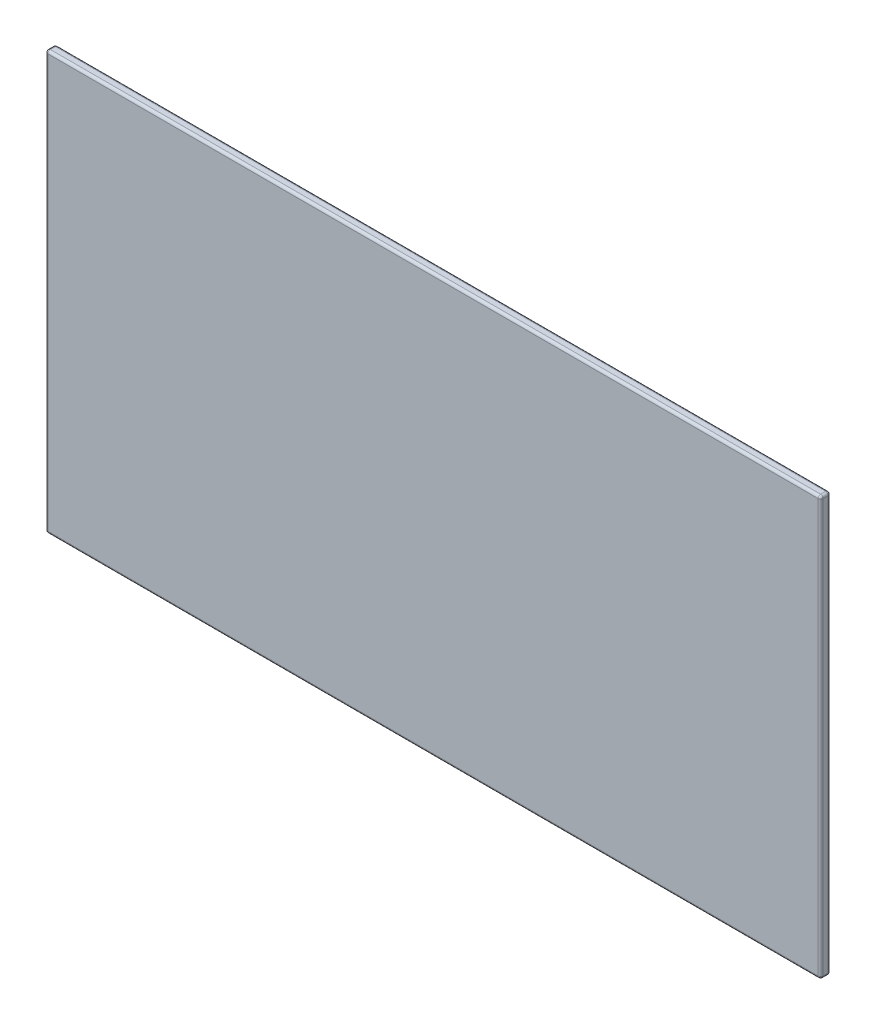
ISO-10303-21;
HEADER;
FILE_DESCRIPTION(('STEP AP214'),'2;1');
FILE_NAME('part.step','',(''),(''),'','','');
FILE_SCHEMA(('AUTOMOTIVE_DESIGN { 1 0 10303 214 1 1 1 1 }'));
ENDSEC;
DATA;
#1=APPLICATION_CONTEXT('core data for automotive mechanical design processes');
#2=APPLICATION_PROTOCOL_DEFINITION('international standard','automotive_design',2000,#1);
#3=PRODUCT_CONTEXT('',#1,'mechanical');
#4=PRODUCT('Part','Part','',(#3));
#5=PRODUCT_RELATED_PRODUCT_CATEGORY('part','',(#4));
#6=PRODUCT_DEFINITION_FORMATION('','',#4);
#7=PRODUCT_DEFINITION_CONTEXT('part definition',#1,'design');
#8=PRODUCT_DEFINITION('design','',#6,#7);
#9=PRODUCT_DEFINITION_SHAPE('','',#8);
#10=(LENGTH_UNIT() NAMED_UNIT(*) SI_UNIT(.MILLI.,.METRE.));
#11=(NAMED_UNIT(*) PLANE_ANGLE_UNIT() SI_UNIT($,.RADIAN.));
#12=(NAMED_UNIT(*) SI_UNIT($,.STERADIAN.) SOLID_ANGLE_UNIT());
#13=UNCERTAINTY_MEASURE_WITH_UNIT(LENGTH_MEASURE(1.E-05),#10,'distance_accuracy_value','');
#14=(GEOMETRIC_REPRESENTATION_CONTEXT(3) GLOBAL_UNCERTAINTY_ASSIGNED_CONTEXT((#13)) GLOBAL_UNIT_ASSIGNED_CONTEXT((#10,
#11,#12)) REPRESENTATION_CONTEXT('',''));
#15=CARTESIAN_POINT('',(0.,0.,0.));
#16=DIRECTION('',(0.,0.,1.));
#17=DIRECTION('',(1.,0.,0.));
#18=AXIS2_PLACEMENT_3D('',#15,#16,#17);
#19=CARTESIAN_POINT('',(77.35,-41.75,2.));
#20=DIRECTION('',(-1.,0.,0.));
#21=DIRECTION('',(0.,0.,1.));
#22=AXIS2_PLACEMENT_3D('',#19,#20,#21);
#23=PLANE('',#22);
#24=DIRECTION('',(0.,1.,0.));
#25=VECTOR('',#24,1.);
#26=CARTESIAN_POINT('',(77.35,-41.75,1.5));
#27=LINE('',#26,#25);
#28=CARTESIAN_POINT('',(77.35,41.25,1.5));
#29=VERTEX_POINT('',#28);
#30=CARTESIAN_POINT('',(77.35,-41.25,1.5));
#31=VERTEX_POINT('',#30);
#32=EDGE_CURVE('E42',#29,#31,#27,.F.);
#33=ORIENTED_EDGE('',*,*,#32,.T.);
#34=DIRECTION('',(0.,0.,-1.));
#35=VECTOR('',#34,1.);
#36=CARTESIAN_POINT('',(77.35,-41.25,2.));
#37=LINE('',#36,#35);
#38=CARTESIAN_POINT('',(77.35,-41.25,0.5));
#39=VERTEX_POINT('',#38);
#40=EDGE_CURVE('E11',#31,#39,#37,.T.);
#41=ORIENTED_EDGE('',*,*,#40,.T.);
#42=DIRECTION('',(0.,1.,0.));
#43=VECTOR('',#42,1.);
#44=CARTESIAN_POINT('',(77.35,41.75,0.5));
#45=LINE('',#44,#43);
#46=CARTESIAN_POINT('',(77.35,41.25,0.5));
#47=VERTEX_POINT('',#46);
#48=EDGE_CURVE('E194',#39,#47,#45,.T.);
#49=ORIENTED_EDGE('',*,*,#48,.T.);
#50=DIRECTION('',(0.,0.,-1.));
#51=VECTOR('',#50,1.);
#52=CARTESIAN_POINT('',(77.35,41.25,2.));
#53=LINE('',#52,#51);
#54=EDGE_CURVE('E53',#47,#29,#53,.F.);
#55=ORIENTED_EDGE('',*,*,#54,.T.);
#56=EDGE_LOOP('',(#33,#41,#49,#55));
#57=FACE_BOUND('',#56,.T.);
#58=ADVANCED_FACE('F33',(#57),#23,.F.);
#59=CARTESIAN_POINT('',(-77.35,41.75,2.));
#60=DIRECTION('',(0.,-1.,0.));
#61=DIRECTION('',(0.,0.,-1.));
#62=AXIS2_PLACEMENT_3D('',#59,#60,#61);
#63=PLANE('',#62);
#64=DIRECTION('',(0.,0.,-1.));
#65=VECTOR('',#64,1.);
#66=CARTESIAN_POINT('',(-76.85,41.75,2.));
#67=LINE('',#66,#65);
#68=CARTESIAN_POINT('',(-76.85,41.75,0.5));
#69=VERTEX_POINT('',#68);
#70=CARTESIAN_POINT('',(-76.85,41.75,1.5));
#71=VERTEX_POINT('',#70);
#72=EDGE_CURVE('E189',#69,#71,#67,.F.);
#73=ORIENTED_EDGE('',*,*,#72,.T.);
#74=DIRECTION('',(-1.,0.,0.));
#75=VECTOR('',#74,1.);
#76=CARTESIAN_POINT('',(-77.35,41.75,1.5));
#77=LINE('',#76,#75);
#78=CARTESIAN_POINT('',(76.85,41.75,1.5));
#79=VERTEX_POINT('',#78);
#80=EDGE_CURVE('E191',#71,#79,#77,.F.);
#81=ORIENTED_EDGE('',*,*,#80,.T.);
#82=DIRECTION('',(0.,0.,-1.));
#83=VECTOR('',#82,1.);
#84=CARTESIAN_POINT('',(76.85,41.75,2.));
#85=LINE('',#84,#83);
#86=CARTESIAN_POINT('',(76.85,41.75,0.5));
#87=VERTEX_POINT('',#86);
#88=EDGE_CURVE('E185',#79,#87,#85,.T.);
#89=ORIENTED_EDGE('',*,*,#88,.T.);
#90=DIRECTION('',(-1.,0.,0.));
#91=VECTOR('',#90,1.);
#92=CARTESIAN_POINT('',(-77.35,41.75,0.5));
#93=LINE('',#92,#91);
#94=EDGE_CURVE('E187',#87,#69,#93,.T.);
#95=ORIENTED_EDGE('',*,*,#94,.T.);
#96=EDGE_LOOP('',(#73,#81,#89,#95));
#97=FACE_BOUND('',#96,.T.);
#98=ADVANCED_FACE('F278',(#97),#63,.F.);
#99=CARTESIAN_POINT('',(-77.35,-41.75,2.));
#100=DIRECTION('',(1.,0.,0.));
#101=DIRECTION('',(0.,0.,-1.));
#102=AXIS2_PLACEMENT_3D('',#99,#100,#101);
#103=PLANE('',#102);
#104=DIRECTION('',(0.,0.,-1.));
#105=VECTOR('',#104,1.);
#106=CARTESIAN_POINT('',(-77.35,-41.25,2.));
#107=LINE('',#106,#105);
#108=CARTESIAN_POINT('',(-77.35,-41.25,0.5));
#109=VERTEX_POINT('',#108);
#110=CARTESIAN_POINT('',(-77.35,-41.25,1.5));
#111=VERTEX_POINT('',#110);
#112=EDGE_CURVE('E180',#109,#111,#107,.F.);
#113=ORIENTED_EDGE('',*,*,#112,.T.);
#114=DIRECTION('',(0.,-1.,0.));
#115=VECTOR('',#114,1.);
#116=CARTESIAN_POINT('',(-77.35,-41.75,1.5));
#117=LINE('',#116,#115);
#118=CARTESIAN_POINT('',(-77.35,41.25,1.5));
#119=VERTEX_POINT('',#118);
#120=EDGE_CURVE('E182',#111,#119,#117,.F.);
#121=ORIENTED_EDGE('',*,*,#120,.T.);
#122=DIRECTION('',(0.,0.,-1.));
#123=VECTOR('',#122,1.);
#124=CARTESIAN_POINT('',(-77.35,41.25,2.));
#125=LINE('',#124,#123);
#126=CARTESIAN_POINT('',(-77.35,41.25,0.5));
#127=VERTEX_POINT('',#126);
#128=EDGE_CURVE('E176',#119,#127,#125,.T.);
#129=ORIENTED_EDGE('',*,*,#128,.T.);
#130=DIRECTION('',(0.,-1.,0.));
#131=VECTOR('',#130,1.);
#132=CARTESIAN_POINT('',(-77.35,-41.75,0.5));
#133=LINE('',#132,#131);
#134=EDGE_CURVE('E178',#127,#109,#133,.T.);
#135=ORIENTED_EDGE('',*,*,#134,.T.);
#136=EDGE_LOOP('',(#113,#121,#129,#135));
#137=FACE_BOUND('',#136,.T.);
#138=ADVANCED_FACE('F269',(#137),#103,.F.);
#139=CARTESIAN_POINT('',(-77.35,-41.75,2.));
#140=DIRECTION('',(0.,1.,0.));
#141=DIRECTION('',(0.,0.,1.));
#142=AXIS2_PLACEMENT_3D('',#139,#140,#141);
#143=PLANE('',#142);
#144=DIRECTION('',(1.,0.,0.));
#145=VECTOR('',#144,1.);
#146=CARTESIAN_POINT('',(-77.35,-41.75,1.5));
#147=LINE('',#146,#145);
#148=CARTESIAN_POINT('',(76.85,-41.75,1.5));
#149=VERTEX_POINT('',#148);
#150=CARTESIAN_POINT('',(-76.85,-41.75,1.5));
#151=VERTEX_POINT('',#150);
#152=EDGE_CURVE('E129',#149,#151,#147,.F.);
#153=ORIENTED_EDGE('',*,*,#152,.T.);
#154=DIRECTION('',(0.,0.,-1.));
#155=VECTOR('',#154,1.);
#156=CARTESIAN_POINT('',(-76.85,-41.75,2.));
#157=LINE('',#156,#155);
#158=CARTESIAN_POINT('',(-76.85,-41.75,0.5));
#159=VERTEX_POINT('',#158);
#160=EDGE_CURVE('E165',#151,#159,#157,.T.);
#161=ORIENTED_EDGE('',*,*,#160,.T.);
#162=DIRECTION('',(1.,0.,0.));
#163=VECTOR('',#162,1.);
#164=CARTESIAN_POINT('',(77.35,-41.75,0.5));
#165=LINE('',#164,#163);
#166=CARTESIAN_POINT('',(76.85,-41.75,0.5));
#167=VERTEX_POINT('',#166);
#168=EDGE_CURVE('E158',#159,#167,#165,.T.);
#169=ORIENTED_EDGE('',*,*,#168,.T.);
#170=DIRECTION('',(0.,0.,-1.));
#171=VECTOR('',#170,1.);
#172=CARTESIAN_POINT('',(76.85,-41.75,2.));
#173=LINE('',#172,#171);
#174=EDGE_CURVE('E156',#167,#149,#173,.F.);
#175=ORIENTED_EDGE('',*,*,#174,.T.);
#176=EDGE_LOOP('',(#153,#161,#169,#175));
#177=FACE_BOUND('',#176,.T.);
#178=ADVANCED_FACE('F356',(#177),#143,.F.);
#179=CARTESIAN_POINT('',(0.,0.,2.));
#180=DIRECTION('',(0.,0.,-1.));
#181=DIRECTION('',(-1.,0.,0.));
#182=AXIS2_PLACEMENT_3D('',#179,#180,#181);
#183=PLANE('',#182);
#184=DIRECTION('',(0.,-1.,0.));
#185=VECTOR('',#184,1.);
#186=CARTESIAN_POINT('',(-76.85,0.,2.));
#187=LINE('',#186,#185);
#188=CARTESIAN_POINT('',(-76.85,41.25,2.));
#189=VERTEX_POINT('',#188);
#190=CARTESIAN_POINT('',(-76.85,-41.25,2.));
#191=VERTEX_POINT('',#190);
#192=EDGE_CURVE('E154',#189,#191,#187,.T.);
#193=ORIENTED_EDGE('',*,*,#192,.T.);
#194=DIRECTION('',(1.,0.,0.));
#195=VECTOR('',#194,1.);
#196=CARTESIAN_POINT('',(0.,-41.25,2.));
#197=LINE('',#196,#195);
#198=CARTESIAN_POINT('',(76.85,-41.25,2.));
#199=VERTEX_POINT('',#198);
#200=EDGE_CURVE('E127',#191,#199,#197,.T.);
#201=ORIENTED_EDGE('',*,*,#200,.T.);
#202=DIRECTION('',(0.,1.,0.));
#203=VECTOR('',#202,1.);
#204=CARTESIAN_POINT('',(76.85,0.,2.));
#205=LINE('',#204,#203);
#206=CARTESIAN_POINT('',(76.85,41.25,2.));
#207=VERTEX_POINT('',#206);
#208=EDGE_CURVE('E144',#199,#207,#205,.T.);
#209=ORIENTED_EDGE('',*,*,#208,.T.);
#210=DIRECTION('',(-1.,0.,0.));
#211=VECTOR('',#210,1.);
#212=CARTESIAN_POINT('',(0.,41.25,2.));
#213=LINE('',#212,#211);
#214=EDGE_CURVE('E150',#207,#189,#213,.T.);
#215=ORIENTED_EDGE('',*,*,#214,.T.);
#216=EDGE_LOOP('',(#193,#201,#209,#215));
#217=FACE_BOUND('',#216,.T.);
#218=ADVANCED_FACE('F152',(#217),#183,.F.);
#219=CARTESIAN_POINT('',(0.,0.,0.));
#220=DIRECTION('',(0.,0.,-1.));
#221=DIRECTION('',(-1.,0.,0.));
#222=AXIS2_PLACEMENT_3D('',#219,#220,#221);
#223=PLANE('',#222);
#224=DIRECTION('',(0.,1.,0.));
#225=VECTOR('',#224,1.);
#226=CARTESIAN_POINT('',(76.85,-41.75,0.));
#227=LINE('',#226,#225);
#228=CARTESIAN_POINT('',(76.85,41.25,0.));
#229=VERTEX_POINT('',#228);
#230=CARTESIAN_POINT('',(76.85,-41.25,0.));
#231=VERTEX_POINT('',#230);
#232=EDGE_CURVE('E167',#229,#231,#227,.F.);
#233=ORIENTED_EDGE('',*,*,#232,.T.);
#234=DIRECTION('',(1.,0.,0.));
#235=VECTOR('',#234,1.);
#236=CARTESIAN_POINT('',(-77.35,-41.25,0.));
#237=LINE('',#236,#235);
#238=CARTESIAN_POINT('',(-76.85,-41.25,0.));
#239=VERTEX_POINT('',#238);
#240=EDGE_CURVE('E173',#231,#239,#237,.F.);
#241=ORIENTED_EDGE('',*,*,#240,.T.);
#242=DIRECTION('',(0.,-1.,0.));
#243=VECTOR('',#242,1.);
#244=CARTESIAN_POINT('',(-76.85,41.75,0.));
#245=LINE('',#244,#243);
#246=CARTESIAN_POINT('',(-76.85,41.25,0.));
#247=VERTEX_POINT('',#246);
#248=EDGE_CURVE('E171',#239,#247,#245,.F.);
#249=ORIENTED_EDGE('',*,*,#248,.T.);
#250=DIRECTION('',(-1.,0.,0.));
#251=VECTOR('',#250,1.);
#252=CARTESIAN_POINT('',(77.35,41.25,0.));
#253=LINE('',#252,#251);
#254=EDGE_CURVE('E169',#247,#229,#253,.F.);
#255=ORIENTED_EDGE('',*,*,#254,.T.);
#256=EDGE_LOOP('',(#233,#241,#249,#255));
#257=FACE_BOUND('',#256,.T.);
#258=ADVANCED_FACE('F296',(#257),#223,.T.);
#259=CARTESIAN_POINT('',(-77.35,41.25,0.5));
#260=DIRECTION('',(1.,0.,0.));
#261=DIRECTION('',(0.,0.,-1.));
#262=AXIS2_PLACEMENT_3D('',#259,#260,#261);
#263=CYLINDRICAL_SURFACE('',#262,0.5);
#264=CARTESIAN_POINT('',(-76.85,41.25,0.5));
#265=DIRECTION('',(-1.,0.,0.));
#266=DIRECTION('',(0.,0.,1.));
#267=AXIS2_PLACEMENT_3D('',#264,#265,#266);
#268=CIRCLE('',#267,0.5);
#269=EDGE_CURVE('E37',#69,#247,#268,.T.);
#270=ORIENTED_EDGE('',*,*,#269,.F.);
#271=ORIENTED_EDGE('',*,*,#94,.F.);
#272=CARTESIAN_POINT('',(76.85,41.25,0.5));
#273=DIRECTION('',(1.,0.,0.));
#274=DIRECTION('',(0.,0.,-1.));
#275=AXIS2_PLACEMENT_3D('',#272,#273,#274);
#276=CIRCLE('',#275,0.5);
#277=EDGE_CURVE('E246',#229,#87,#276,.T.);
#278=ORIENTED_EDGE('',*,*,#277,.F.);
#279=ORIENTED_EDGE('',*,*,#254,.F.);
#280=EDGE_LOOP('',(#270,#271,#278,#279));
#281=FACE_BOUND('',#280,.T.);
#282=ADVANCED_FACE('F35',(#281),#263,.T.);
#283=CARTESIAN_POINT('',(-76.85,41.25,0.5));
#284=DIRECTION('',(0.,0.,1.));
#285=DIRECTION('',(1.,0.,0.));
#286=AXIS2_PLACEMENT_3D('',#283,#284,#285);
#287=SPHERICAL_SURFACE('',#286,0.5);
#288=CARTESIAN_POINT('',(-76.85,41.25,0.5));
#289=DIRECTION('',(0.,0.,-1.));
#290=DIRECTION('',(-1.,0.,0.));
#291=AXIS2_PLACEMENT_3D('',#288,#289,#290);
#292=CIRCLE('',#291,0.5);
#293=EDGE_CURVE('E241',#69,#127,#292,.F.);
#294=ORIENTED_EDGE('',*,*,#293,.F.);
#295=ORIENTED_EDGE('',*,*,#269,.T.);
#296=CARTESIAN_POINT('',(-76.85,41.25,0.5));
#297=DIRECTION('',(0.,1.,0.));
#298=DIRECTION('',(0.,0.,1.));
#299=AXIS2_PLACEMENT_3D('',#296,#297,#298);
#300=CIRCLE('',#299,0.5);
#301=EDGE_CURVE('E244',#127,#247,#300,.F.);
#302=ORIENTED_EDGE('',*,*,#301,.F.);
#303=EDGE_LOOP('',(#294,#295,#302));
#304=FACE_BOUND('',#303,.T.);
#305=ADVANCED_FACE('F257',(#304),#287,.T.);
#306=CARTESIAN_POINT('',(76.85,41.25,0.5));
#307=DIRECTION('',(0.,0.,1.));
#308=DIRECTION('',(1.,0.,0.));
#309=AXIS2_PLACEMENT_3D('',#306,#307,#308);
#310=SPHERICAL_SURFACE('',#309,0.5);
#311=CARTESIAN_POINT('',(76.85,41.25,0.5));
#312=DIRECTION('',(0.,1.,0.));
#313=DIRECTION('',(0.,0.,1.));
#314=AXIS2_PLACEMENT_3D('',#311,#312,#313);
#315=CIRCLE('',#314,0.5);
#316=EDGE_CURVE('E235',#229,#47,#315,.F.);
#317=ORIENTED_EDGE('',*,*,#316,.F.);
#318=ORIENTED_EDGE('',*,*,#277,.T.);
#319=CARTESIAN_POINT('',(76.85,41.25,0.5));
#320=DIRECTION('',(0.,0.,-1.));
#321=DIRECTION('',(-1.,0.,0.));
#322=AXIS2_PLACEMENT_3D('',#319,#320,#321);
#323=CIRCLE('',#322,0.5);
#324=EDGE_CURVE('E238',#47,#87,#323,.F.);
#325=ORIENTED_EDGE('',*,*,#324,.F.);
#326=EDGE_LOOP('',(#317,#318,#325));
#327=FACE_BOUND('',#326,.T.);
#328=ADVANCED_FACE('F289',(#327),#310,.T.);
#329=CARTESIAN_POINT('',(-76.85,-41.75,0.5));
#330=DIRECTION('',(0.,1.,0.));
#331=DIRECTION('',(0.,0.,1.));
#332=AXIS2_PLACEMENT_3D('',#329,#330,#331);
#333=CYLINDRICAL_SURFACE('',#332,0.5);
#334=ORIENTED_EDGE('',*,*,#301,.T.);
#335=ORIENTED_EDGE('',*,*,#248,.F.);
#336=CARTESIAN_POINT('',(-76.85,-41.25,0.5));
#337=DIRECTION('',(0.,-1.,0.));
#338=DIRECTION('',(0.,0.,-1.));
#339=AXIS2_PLACEMENT_3D('',#336,#337,#338);
#340=CIRCLE('',#339,0.5);
#341=EDGE_CURVE('E230',#109,#239,#340,.T.);
#342=ORIENTED_EDGE('',*,*,#341,.F.);
#343=ORIENTED_EDGE('',*,*,#134,.F.);
#344=EDGE_LOOP('',(#334,#335,#342,#343));
#345=FACE_BOUND('',#344,.T.);
#346=ADVANCED_FACE('F265',(#345),#333,.T.);
#347=CARTESIAN_POINT('',(-76.85,41.25,2.));
#348=DIRECTION('',(0.,0.,-1.));
#349=DIRECTION('',(-1.,0.,0.));
#350=AXIS2_PLACEMENT_3D('',#347,#348,#349);
#351=CYLINDRICAL_SURFACE('',#350,0.5);
#352=ORIENTED_EDGE('',*,*,#293,.T.);
#353=ORIENTED_EDGE('',*,*,#128,.F.);
#354=CARTESIAN_POINT('',(-76.85,41.25,1.5));
#355=DIRECTION('',(0.,0.,1.));
#356=DIRECTION('',(1.,0.,0.));
#357=AXIS2_PLACEMENT_3D('',#354,#355,#356);
#358=CIRCLE('',#357,0.5);
#359=EDGE_CURVE('E227',#71,#119,#358,.T.);
#360=ORIENTED_EDGE('',*,*,#359,.F.);
#361=ORIENTED_EDGE('',*,*,#72,.F.);
#362=EDGE_LOOP('',(#352,#353,#360,#361));
#363=FACE_BOUND('',#362,.T.);
#364=ADVANCED_FACE('F275',(#363),#351,.T.);
#365=CARTESIAN_POINT('',(0.,41.25,1.5));
#366=DIRECTION('',(-1.,0.,0.));
#367=DIRECTION('',(0.,0.,1.));
#368=AXIS2_PLACEMENT_3D('',#365,#366,#367);
#369=CYLINDRICAL_SURFACE('',#368,0.5);
#370=CARTESIAN_POINT('',(76.85,41.25,1.5));
#371=DIRECTION('',(1.,0.,0.));
#372=DIRECTION('',(0.,0.,-1.));
#373=AXIS2_PLACEMENT_3D('',#370,#371,#372);
#374=CIRCLE('',#373,0.5);
#375=EDGE_CURVE('E221',#79,#207,#374,.T.);
#376=ORIENTED_EDGE('',*,*,#375,.F.);
#377=ORIENTED_EDGE('',*,*,#80,.F.);
#378=CARTESIAN_POINT('',(-76.85,41.25,1.5));
#379=DIRECTION('',(-1.,0.,0.));
#380=DIRECTION('',(0.,0.,1.));
#381=AXIS2_PLACEMENT_3D('',#378,#379,#380);
#382=CIRCLE('',#381,0.5);
#383=EDGE_CURVE('E224',#189,#71,#382,.T.);
#384=ORIENTED_EDGE('',*,*,#383,.F.);
#385=ORIENTED_EDGE('',*,*,#214,.F.);
#386=EDGE_LOOP('',(#376,#377,#384,#385));
#387=FACE_BOUND('',#386,.T.);
#388=ADVANCED_FACE('F282',(#387),#369,.T.);
#389=CARTESIAN_POINT('',(76.85,41.25,2.));
#390=DIRECTION('',(0.,0.,-1.));
#391=DIRECTION('',(-1.,0.,0.));
#392=AXIS2_PLACEMENT_3D('',#389,#390,#391);
#393=CYLINDRICAL_SURFACE('',#392,0.5);
#394=ORIENTED_EDGE('',*,*,#324,.T.);
#395=ORIENTED_EDGE('',*,*,#88,.F.);
#396=CARTESIAN_POINT('',(76.85,41.25,1.5));
#397=DIRECTION('',(0.,0.,1.));
#398=DIRECTION('',(1.,0.,0.));
#399=AXIS2_PLACEMENT_3D('',#396,#397,#398);
#400=CIRCLE('',#399,0.5);
#401=EDGE_CURVE('E219',#29,#79,#400,.T.);
#402=ORIENTED_EDGE('',*,*,#401,.F.);
#403=ORIENTED_EDGE('',*,*,#54,.F.);
#404=EDGE_LOOP('',(#394,#395,#402,#403));
#405=FACE_BOUND('',#404,.T.);
#406=ADVANCED_FACE('F287',(#405),#393,.T.);
#407=CARTESIAN_POINT('',(76.85,-41.75,0.5));
#408=DIRECTION('',(0.,-1.,0.));
#409=DIRECTION('',(0.,0.,-1.));
#410=AXIS2_PLACEMENT_3D('',#407,#408,#409);
#411=CYLINDRICAL_SURFACE('',#410,0.5);
#412=ORIENTED_EDGE('',*,*,#316,.T.);
#413=ORIENTED_EDGE('',*,*,#48,.F.);
#414=CARTESIAN_POINT('',(76.85,-41.25,0.5));
#415=DIRECTION('',(0.,-1.,0.));
#416=DIRECTION('',(0.,0.,-1.));
#417=AXIS2_PLACEMENT_3D('',#414,#415,#416);
#418=CIRCLE('',#417,0.5);
#419=EDGE_CURVE('E216',#231,#39,#418,.T.);
#420=ORIENTED_EDGE('',*,*,#419,.F.);
#421=ORIENTED_EDGE('',*,*,#232,.F.);
#422=EDGE_LOOP('',(#412,#413,#420,#421));
#423=FACE_BOUND('',#422,.T.);
#424=ADVANCED_FACE('F293',(#423),#411,.T.);
#425=CARTESIAN_POINT('',(-77.35,-41.25,0.5));
#426=DIRECTION('',(-1.,0.,0.));
#427=DIRECTION('',(0.,0.,1.));
#428=AXIS2_PLACEMENT_3D('',#425,#426,#427);
#429=CYLINDRICAL_SURFACE('',#428,0.5);
#430=CARTESIAN_POINT('',(-76.85,-41.25,0.5));
#431=DIRECTION('',(-1.,0.,0.));
#432=DIRECTION('',(0.,0.,1.));
#433=AXIS2_PLACEMENT_3D('',#430,#431,#432);
#434=CIRCLE('',#433,0.5);
#435=EDGE_CURVE('E232',#239,#159,#434,.T.);
#436=ORIENTED_EDGE('',*,*,#435,.F.);
#437=ORIENTED_EDGE('',*,*,#240,.F.);
#438=CARTESIAN_POINT('',(76.85,-41.25,0.5));
#439=DIRECTION('',(1.,0.,0.));
#440=DIRECTION('',(0.,0.,-1.));
#441=AXIS2_PLACEMENT_3D('',#438,#439,#440);
#442=CIRCLE('',#441,0.5);
#443=EDGE_CURVE('E213',#167,#231,#442,.T.);
#444=ORIENTED_EDGE('',*,*,#443,.F.);
#445=ORIENTED_EDGE('',*,*,#168,.F.);
#446=EDGE_LOOP('',(#436,#437,#444,#445));
#447=FACE_BOUND('',#446,.T.);
#448=ADVANCED_FACE('F300',(#447),#429,.T.);
#449=CARTESIAN_POINT('',(-76.85,-41.25,0.5));
#450=DIRECTION('',(0.,0.,1.));
#451=DIRECTION('',(1.,0.,0.));
#452=AXIS2_PLACEMENT_3D('',#449,#450,#451);
#453=SPHERICAL_SURFACE('',#452,0.5);
#454=ORIENTED_EDGE('',*,*,#341,.T.);
#455=ORIENTED_EDGE('',*,*,#435,.T.);
#456=CARTESIAN_POINT('',(-76.85,-41.25,0.5));
#457=DIRECTION('',(0.,0.,-1.));
#458=DIRECTION('',(-1.,0.,0.));
#459=AXIS2_PLACEMENT_3D('',#456,#457,#458);
#460=CIRCLE('',#459,0.5);
#461=EDGE_CURVE('E210',#109,#159,#460,.F.);
#462=ORIENTED_EDGE('',*,*,#461,.F.);
#463=EDGE_LOOP('',(#454,#455,#462));
#464=FACE_BOUND('',#463,.T.);
#465=ADVANCED_FACE('F304',(#464),#453,.T.);
#466=CARTESIAN_POINT('',(-76.85,41.25,1.5));
#467=DIRECTION('',(0.,0.,1.));
#468=DIRECTION('',(1.,0.,0.));
#469=AXIS2_PLACEMENT_3D('',#466,#467,#468);
#470=SPHERICAL_SURFACE('',#469,0.5);
#471=ORIENTED_EDGE('',*,*,#383,.T.);
#472=ORIENTED_EDGE('',*,*,#359,.T.);
#473=CARTESIAN_POINT('',(-76.85,41.25,1.5));
#474=DIRECTION('',(0.,1.,0.));
#475=DIRECTION('',(0.,0.,1.));
#476=AXIS2_PLACEMENT_3D('',#473,#474,#475);
#477=CIRCLE('',#476,0.5);
#478=EDGE_CURVE('E208',#189,#119,#477,.F.);
#479=ORIENTED_EDGE('',*,*,#478,.F.);
#480=EDGE_LOOP('',(#471,#472,#479));
#481=FACE_BOUND('',#480,.T.);
#482=ADVANCED_FACE('F315',(#481),#470,.T.);
#483=CARTESIAN_POINT('',(76.85,41.25,1.5));
#484=DIRECTION('',(0.,0.,1.));
#485=DIRECTION('',(1.,0.,0.));
#486=AXIS2_PLACEMENT_3D('',#483,#484,#485);
#487=SPHERICAL_SURFACE('',#486,0.5);
#488=ORIENTED_EDGE('',*,*,#401,.T.);
#489=ORIENTED_EDGE('',*,*,#375,.T.);
#490=CARTESIAN_POINT('',(76.85,41.25,1.5));
#491=DIRECTION('',(0.,1.,0.));
#492=DIRECTION('',(0.,0.,1.));
#493=AXIS2_PLACEMENT_3D('',#490,#491,#492);
#494=CIRCLE('',#493,0.5);
#495=EDGE_CURVE('E147',#29,#207,#494,.F.);
#496=ORIENTED_EDGE('',*,*,#495,.F.);
#497=EDGE_LOOP('',(#488,#489,#496));
#498=FACE_BOUND('',#497,.T.);
#499=ADVANCED_FACE('F317',(#498),#487,.T.);
#500=CARTESIAN_POINT('',(76.85,-41.25,0.5));
#501=DIRECTION('',(0.,0.,1.));
#502=DIRECTION('',(1.,0.,0.));
#503=AXIS2_PLACEMENT_3D('',#500,#501,#502);
#504=SPHERICAL_SURFACE('',#503,0.5);
#505=ORIENTED_EDGE('',*,*,#443,.T.);
#506=ORIENTED_EDGE('',*,*,#419,.T.);
#507=CARTESIAN_POINT('',(76.85,-41.25,0.5));
#508=DIRECTION('',(0.,0.,-1.));
#509=DIRECTION('',(-1.,0.,0.));
#510=AXIS2_PLACEMENT_3D('',#507,#508,#509);
#511=CIRCLE('',#510,0.5);
#512=EDGE_CURVE('E205',#167,#39,#511,.F.);
#513=ORIENTED_EDGE('',*,*,#512,.F.);
#514=EDGE_LOOP('',(#505,#506,#513));
#515=FACE_BOUND('',#514,.T.);
#516=ADVANCED_FACE('F323',(#515),#504,.T.);
#517=CARTESIAN_POINT('',(-76.85,-41.25,2.));
#518=DIRECTION('',(0.,0.,-1.));
#519=DIRECTION('',(-1.,0.,0.));
#520=AXIS2_PLACEMENT_3D('',#517,#518,#519);
#521=CYLINDRICAL_SURFACE('',#520,0.5);
#522=ORIENTED_EDGE('',*,*,#461,.T.);
#523=ORIENTED_EDGE('',*,*,#160,.F.);
#524=CARTESIAN_POINT('',(-76.85,-41.25,1.5));
#525=DIRECTION('',(0.,0.,1.));
#526=DIRECTION('',(1.,0.,0.));
#527=AXIS2_PLACEMENT_3D('',#524,#525,#526);
#528=CIRCLE('',#527,0.5);
#529=EDGE_CURVE('E202',#111,#151,#528,.T.);
#530=ORIENTED_EDGE('',*,*,#529,.F.);
#531=ORIENTED_EDGE('',*,*,#112,.F.);
#532=EDGE_LOOP('',(#522,#523,#530,#531));
#533=FACE_BOUND('',#532,.T.);
#534=ADVANCED_FACE('F307',(#533),#521,.T.);
#535=CARTESIAN_POINT('',(-76.85,0.,1.5));
#536=DIRECTION('',(0.,-1.,0.));
#537=DIRECTION('',(0.,0.,-1.));
#538=AXIS2_PLACEMENT_3D('',#535,#536,#537);
#539=CYLINDRICAL_SURFACE('',#538,0.5);
#540=ORIENTED_EDGE('',*,*,#478,.T.);
#541=ORIENTED_EDGE('',*,*,#120,.F.);
#542=CARTESIAN_POINT('',(-76.85,-41.25,1.5));
#543=DIRECTION('',(0.,-1.,0.));
#544=DIRECTION('',(0.,0.,-1.));
#545=AXIS2_PLACEMENT_3D('',#542,#543,#544);
#546=CIRCLE('',#545,0.5);
#547=EDGE_CURVE('E141',#191,#111,#546,.T.);
#548=ORIENTED_EDGE('',*,*,#547,.F.);
#549=ORIENTED_EDGE('',*,*,#192,.F.);
#550=EDGE_LOOP('',(#540,#541,#548,#549));
#551=FACE_BOUND('',#550,.T.);
#552=ADVANCED_FACE('F313',(#551),#539,.T.);
#553=CARTESIAN_POINT('',(76.85,0.,1.5));
#554=DIRECTION('',(0.,1.,0.));
#555=DIRECTION('',(0.,0.,1.));
#556=AXIS2_PLACEMENT_3D('',#553,#554,#555);
#557=CYLINDRICAL_SURFACE('',#556,0.5);
#558=ORIENTED_EDGE('',*,*,#495,.T.);
#559=ORIENTED_EDGE('',*,*,#208,.F.);
#560=CARTESIAN_POINT('',(76.85,-41.25,1.5));
#561=DIRECTION('',(0.,-1.,0.));
#562=DIRECTION('',(0.,0.,-1.));
#563=AXIS2_PLACEMENT_3D('',#560,#561,#562);
#564=CIRCLE('',#563,0.5);
#565=EDGE_CURVE('E135',#31,#199,#564,.T.);
#566=ORIENTED_EDGE('',*,*,#565,.F.);
#567=ORIENTED_EDGE('',*,*,#32,.F.);
#568=EDGE_LOOP('',(#558,#559,#566,#567));
#569=FACE_BOUND('',#568,.T.);
#570=ADVANCED_FACE('F145',(#569),#557,.T.);
#571=CARTESIAN_POINT('',(76.85,-41.25,2.));
#572=DIRECTION('',(0.,0.,-1.));
#573=DIRECTION('',(-1.,0.,0.));
#574=AXIS2_PLACEMENT_3D('',#571,#572,#573);
#575=CYLINDRICAL_SURFACE('',#574,0.5);
#576=ORIENTED_EDGE('',*,*,#512,.T.);
#577=ORIENTED_EDGE('',*,*,#40,.F.);
#578=CARTESIAN_POINT('',(76.85,-41.25,1.5));
#579=DIRECTION('',(0.,0.,1.));
#580=DIRECTION('',(1.,0.,0.));
#581=AXIS2_PLACEMENT_3D('',#578,#579,#580);
#582=CIRCLE('',#581,0.5);
#583=EDGE_CURVE('E139',#149,#31,#582,.T.);
#584=ORIENTED_EDGE('',*,*,#583,.F.);
#585=ORIENTED_EDGE('',*,*,#174,.F.);
#586=EDGE_LOOP('',(#576,#577,#584,#585));
#587=FACE_BOUND('',#586,.T.);
#588=ADVANCED_FACE('F340',(#587),#575,.T.);
#589=CARTESIAN_POINT('',(-76.85,-41.25,1.5));
#590=DIRECTION('',(0.,0.,1.));
#591=DIRECTION('',(1.,0.,0.));
#592=AXIS2_PLACEMENT_3D('',#589,#590,#591);
#593=SPHERICAL_SURFACE('',#592,0.5);
#594=ORIENTED_EDGE('',*,*,#547,.T.);
#595=ORIENTED_EDGE('',*,*,#529,.T.);
#596=CARTESIAN_POINT('',(-76.85,-41.25,1.5));
#597=DIRECTION('',(-1.,0.,0.));
#598=DIRECTION('',(0.,0.,1.));
#599=AXIS2_PLACEMENT_3D('',#596,#597,#598);
#600=CIRCLE('',#599,0.5);
#601=EDGE_CURVE('E132',#191,#151,#600,.F.);
#602=ORIENTED_EDGE('',*,*,#601,.F.);
#603=EDGE_LOOP('',(#594,#595,#602));
#604=FACE_BOUND('',#603,.T.);
#605=ADVANCED_FACE('F311',(#604),#593,.T.);
#606=CARTESIAN_POINT('',(76.85,-41.25,1.5));
#607=DIRECTION('',(0.,0.,1.));
#608=DIRECTION('',(1.,0.,0.));
#609=AXIS2_PLACEMENT_3D('',#606,#607,#608);
#610=SPHERICAL_SURFACE('',#609,0.5);
#611=ORIENTED_EDGE('',*,*,#583,.T.);
#612=ORIENTED_EDGE('',*,*,#565,.T.);
#613=CARTESIAN_POINT('',(76.85,-41.25,1.5));
#614=DIRECTION('',(1.,0.,0.));
#615=DIRECTION('',(0.,0.,-1.));
#616=AXIS2_PLACEMENT_3D('',#613,#614,#615);
#617=CIRCLE('',#616,0.5);
#618=EDGE_CURVE('E123',#149,#199,#617,.F.);
#619=ORIENTED_EDGE('',*,*,#618,.F.);
#620=EDGE_LOOP('',(#611,#612,#619));
#621=FACE_BOUND('',#620,.T.);
#622=ADVANCED_FACE('F137',(#621),#610,.T.);
#623=CARTESIAN_POINT('',(0.,-41.25,1.5));
#624=DIRECTION('',(1.,0.,0.));
#625=DIRECTION('',(0.,0.,-1.));
#626=AXIS2_PLACEMENT_3D('',#623,#624,#625);
#627=CYLINDRICAL_SURFACE('',#626,0.5);
#628=ORIENTED_EDGE('',*,*,#601,.T.);
#629=ORIENTED_EDGE('',*,*,#152,.F.);
#630=ORIENTED_EDGE('',*,*,#618,.T.);
#631=ORIENTED_EDGE('',*,*,#200,.F.);
#632=EDGE_LOOP('',(#628,#629,#630,#631));
#633=FACE_BOUND('',#632,.T.);
#634=ADVANCED_FACE('F125',(#633),#627,.T.);
#635=CLOSED_SHELL('',(#58,#98,#138,#178,#218,#258,#282,#305,#328,#346,#364,#388,#406,#424,#448,
#465,#482,#499,#516,#534,#552,#570,#588,#605,#622,#634));
#636=MANIFOLD_SOLID_BREP('B2',#635);
#637=ADVANCED_BREP_SHAPE_REPRESENTATION('',(#18,#636),#14);
#638=SHAPE_DEFINITION_REPRESENTATION(#9,#637);
ENDSEC;
END-ISO-10303-21;
